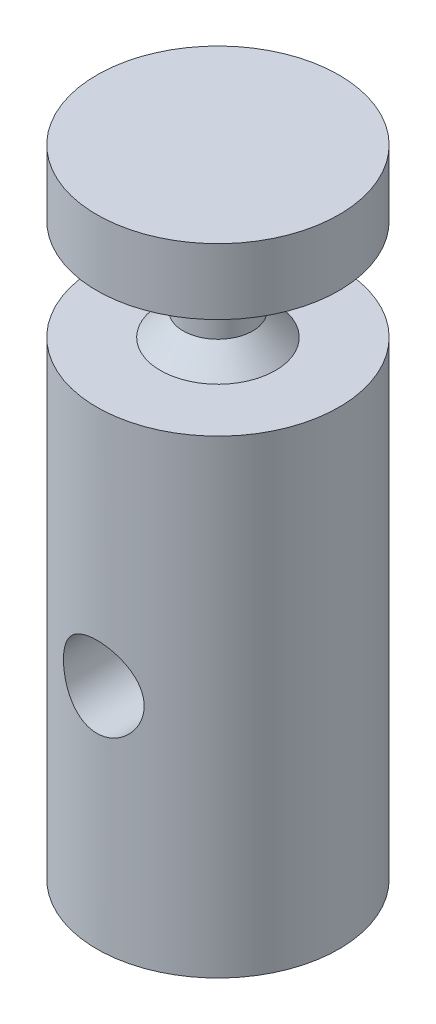
ISO-10303-21;
HEADER;
FILE_DESCRIPTION(('STEP AP214'),'2;1');
FILE_NAME('part.step','',(''),(''),'','','');
FILE_SCHEMA(('AUTOMOTIVE_DESIGN { 1 0 10303 214 1 1 1 1 }'));
ENDSEC;
DATA;
#1=APPLICATION_CONTEXT('core data for automotive mechanical design processes');
#2=APPLICATION_PROTOCOL_DEFINITION('international standard','automotive_design',2000,#1);
#3=PRODUCT_CONTEXT('',#1,'mechanical');
#4=PRODUCT('Part','Part','',(#3));
#5=PRODUCT_RELATED_PRODUCT_CATEGORY('part','',(#4));
#6=PRODUCT_DEFINITION_FORMATION('','',#4);
#7=PRODUCT_DEFINITION_CONTEXT('part definition',#1,'design');
#8=PRODUCT_DEFINITION('design','',#6,#7);
#9=PRODUCT_DEFINITION_SHAPE('','',#8);
#10=(LENGTH_UNIT() NAMED_UNIT(*) SI_UNIT(.MILLI.,.METRE.));
#11=(NAMED_UNIT(*) PLANE_ANGLE_UNIT() SI_UNIT($,.RADIAN.));
#12=(NAMED_UNIT(*) SI_UNIT($,.STERADIAN.) SOLID_ANGLE_UNIT());
#13=UNCERTAINTY_MEASURE_WITH_UNIT(LENGTH_MEASURE(1.E-05),#10,'distance_accuracy_value','');
#14=(GEOMETRIC_REPRESENTATION_CONTEXT(3) GLOBAL_UNCERTAINTY_ASSIGNED_CONTEXT((#13)) GLOBAL_UNIT_ASSIGNED_CONTEXT((#10,
#11,#12)) REPRESENTATION_CONTEXT('',''));
#15=CARTESIAN_POINT('',(0.,0.,0.));
#16=DIRECTION('',(0.,0.,1.));
#17=DIRECTION('',(1.,0.,0.));
#18=AXIS2_PLACEMENT_3D('',#15,#16,#17);
#19=CARTESIAN_POINT('',(0.,38.71775,0.));
#20=DIRECTION('',(0.,-1.,0.));
#21=DIRECTION('',(0.,0.,-1.));
#22=AXIS2_PLACEMENT_3D('',#19,#20,#21);
#23=CONICAL_SURFACE('',#22,2.73,0.785398163397443);
#24=CARTESIAN_POINT('',(0.,36.92275,0.));
#25=DIRECTION('',(0.,-1.,0.));
#26=DIRECTION('',(0.,0.,-1.));
#27=AXIS2_PLACEMENT_3D('',#24,#25,#26);
#28=CIRCLE('',#27,4.52499999999999);
#29=CARTESIAN_POINT('',(0.,36.92275,-4.52499999999999));
#30=VERTEX_POINT('',#29);
#31=EDGE_CURVE('E48',#30,#30,#28,.T.);
#32=ORIENTED_EDGE('',*,*,#31,.F.);
#33=EDGE_LOOP('',(#32));
#34=FACE_BOUND('',#33,.T.);
#35=CARTESIAN_POINT('',(0.,38.71775,0.));
#36=DIRECTION('',(0.,-1.,0.));
#37=DIRECTION('',(0.,0.,-1.));
#38=AXIS2_PLACEMENT_3D('',#35,#36,#37);
#39=CIRCLE('',#38,2.73);
#40=CARTESIAN_POINT('',(0.,38.71775,-2.73));
#41=VERTEX_POINT('',#40);
#42=EDGE_CURVE('E103',#41,#41,#39,.T.);
#43=ORIENTED_EDGE('',*,*,#42,.T.);
#44=EDGE_LOOP('',(#43));
#45=FACE_BOUND('',#44,.T.);
#46=ADVANCED_FACE('F34',(#34,#45),#23,.T.);
#47=CARTESIAN_POINT('',(0.,36.92275,0.));
#48=DIRECTION('',(0.,-1.,0.));
#49=DIRECTION('',(0.,0.,-1.));
#50=AXIS2_PLACEMENT_3D('',#47,#48,#49);
#51=PLANE('',#50);
#52=CARTESIAN_POINT('',(0.,36.92275,0.));
#53=DIRECTION('',(0.,-1.,0.));
#54=DIRECTION('',(0.,0.,-1.));
#55=AXIS2_PLACEMENT_3D('',#52,#53,#54);
#56=CIRCLE('',#55,9.525);
#57=CARTESIAN_POINT('',(0.,36.92275,-9.525));
#58=VERTEX_POINT('',#57);
#59=EDGE_CURVE('E52',#58,#58,#56,.T.);
#60=ORIENTED_EDGE('',*,*,#59,.F.);
#61=EDGE_LOOP('',(#60));
#62=FACE_BOUND('',#61,.T.);
#63=ORIENTED_EDGE('',*,*,#31,.T.);
#64=EDGE_LOOP('',(#63));
#65=FACE_BOUND('',#64,.T.);
#66=ADVANCED_FACE('F91',(#62,#65),#51,.F.);
#67=CARTESIAN_POINT('',(0.,0.,0.));
#68=DIRECTION('',(0.,-1.,0.));
#69=DIRECTION('',(0.,0.,-1.));
#70=AXIS2_PLACEMENT_3D('',#67,#68,#69);
#71=CYLINDRICAL_SURFACE('',#70,9.525);
#72=CARTESIAN_POINT('',(0.,21.05,-9.525));
#73=CARTESIAN_POINT('',(-0.173238677165346,21.0500008055979,-9.52500048580497));
#74=CARTESIAN_POINT('',(-0.346472492659896,21.0357751550461,-9.52023018186455));
#75=CARTESIAN_POINT('',(-0.687837590771685,20.9794225795053,-9.50167042395416));
#76=CARTESIAN_POINT('',(-0.855968341777244,20.9372927579622,-9.48788003366834));
#77=CARTESIAN_POINT('',(-1.18215660666814,20.8267364022556,-9.45277852602955));
#78=CARTESIAN_POINT('',(-1.34023044718816,20.7583538266918,-9.43147998545459));
#79=CARTESIAN_POINT('',(-1.6426654243569,20.5974317762382,-9.3835361515256));
#80=CARTESIAN_POINT('',(-1.78702384834388,20.5048875361167,-9.35688980370195));
#81=CARTESIAN_POINT('',(-2.06292981819569,20.2949030695734,-9.30002249856541));
#82=CARTESIAN_POINT('',(-2.19393674844713,20.1767758312229,-9.26971591772517));
#83=CARTESIAN_POINT('',(-2.43469379932911,19.9204392838066,-9.20941499436411));
#84=CARTESIAN_POINT('',(-2.54443923892903,19.782225564102,-9.17942072197493));
#85=CARTESIAN_POINT('',(-2.74264419157344,19.4847722592512,-9.12219830615344));
#86=CARTESIAN_POINT('',(-2.83040092485177,19.3250423763505,-9.0950744970031));
#87=CARTESIAN_POINT('',(-2.97757492456176,18.9920409000941,-9.04796594704058));
#88=CARTESIAN_POINT('',(-3.03700083920297,18.8187734580083,-9.02797902810367));
#89=CARTESIAN_POINT('',(-3.12379824029158,18.4697625217479,-8.99830887880273));
#90=CARTESIAN_POINT('',(-3.15218269826286,18.2942993630472,-8.98830104068516));
#91=CARTESIAN_POINT('',(-3.17925806658696,17.9408375805551,-8.97876209798686));
#92=CARTESIAN_POINT('',(-3.17795815259497,17.7628397572483,-8.97922775597168));
#93=CARTESIAN_POINT('',(-3.14648819425835,17.4180011983402,-8.99029872650972));
#94=CARTESIAN_POINT('',(-3.1176401743052,17.2510223207321,-9.00043970379417));
#95=CARTESIAN_POINT('',(-3.03404956704689,16.9244258927483,-9.02895888275449));
#96=CARTESIAN_POINT('',(-2.97930387942918,16.7648092262437,-9.04733807064542));
#97=CARTESIAN_POINT('',(-2.84460650934116,16.4544645200471,-9.09059367841715));
#98=CARTESIAN_POINT('',(-2.76426310464555,16.3039210191343,-9.11556996393148));
#99=CARTESIAN_POINT('',(-2.58092291251246,16.0180348662119,-9.16916373477931));
#100=CARTESIAN_POINT('',(-2.47791958175571,15.8826966219865,-9.19778227084722));
#101=CARTESIAN_POINT('',(-2.2458341312661,15.6236341758396,-9.25726270107577));
#102=CARTESIAN_POINT('',(-2.11567125149228,15.5008851949337,-9.28816371201626));
#103=CARTESIAN_POINT('',(-1.83622813465495,15.2787032283437,-9.34742029378841));
#104=CARTESIAN_POINT('',(-1.68694606622308,15.1792724788277,-9.37577562033364));
#105=CARTESIAN_POINT('',(-1.3714336714219,15.0057642467537,-9.42711817702495));
#106=CARTESIAN_POINT('',(-1.20504990262186,14.9319480649932,-9.45004936275524));
#107=CARTESIAN_POINT('',(-0.861279339682308,14.8136549226906,-9.4875530068358));
#108=CARTESIAN_POINT('',(-0.683896391141977,14.7691677705306,-9.50212836854241));
#109=CARTESIAN_POINT('',(-0.331418658755541,14.712523260379,-9.52079715951823));
#110=CARTESIAN_POINT('',(-0.156557979570887,14.6990481058765,-9.52531755822086));
#111=CARTESIAN_POINT('',(0.192960847123755,14.7010562386752,-9.52464766056077));
#112=CARTESIAN_POINT('',(0.367619023839891,14.7165346379361,-9.51945900331475));
#113=CARTESIAN_POINT('',(0.706500575516011,14.7749678070617,-9.50023578476806));
#114=CARTESIAN_POINT('',(0.870879661700627,14.8171137042072,-9.48646180908035));
#115=CARTESIAN_POINT('',(1.19016766849014,14.9266741861819,-9.45171613685472));
#116=CARTESIAN_POINT('',(1.34507537851482,14.9940919933102,-9.43074352248193));
#117=CARTESIAN_POINT('',(1.64556534104864,15.1542486210945,-9.38304356837145));
#118=CARTESIAN_POINT('',(1.79079512051444,15.2476068336741,-9.35617936849621));
#119=CARTESIAN_POINT('',(2.06395583568048,15.4562664262928,-9.29974181184133));
#120=CARTESIAN_POINT('',(2.19188146775095,15.5715745079009,-9.27016762910402));
#121=CARTESIAN_POINT('',(2.43285171228499,15.8270575344459,-9.20993992337912));
#122=CARTESIAN_POINT('',(2.54495607735531,15.9681242954928,-9.17929841452584));
#123=CARTESIAN_POINT('',(2.74401763337734,16.2677247277996,-9.121774152107));
#124=CARTESIAN_POINT('',(2.83097461468096,16.4262585446632,-9.09489142987857));
#125=CARTESIAN_POINT('',(2.97687025407194,16.7563618235454,-9.04819093937643));
#126=CARTESIAN_POINT('',(3.03586556962393,16.9279041013608,-9.02835890517708));
#127=CARTESIAN_POINT('',(3.12386556696094,17.2793022138901,-8.99829392572978));
#128=CARTESIAN_POINT('',(3.15288375947875,17.4591542651588,-8.98805665630055));
#129=CARTESIAN_POINT('',(3.17905219686555,17.8121257799299,-8.97883201925513));
#130=CARTESIAN_POINT('',(3.17776306695416,17.9851164304107,-8.97929370817293));
#131=CARTESIAN_POINT('',(3.14719428169959,18.3282791128775,-8.99005281690779));
#132=CARTESIAN_POINT('',(3.117916292281,18.4984513120074,-9.00034965132723));
#133=CARTESIAN_POINT('',(3.03330550668566,18.8279307300329,-9.02920864668031));
#134=CARTESIAN_POINT('',(2.97847812359925,18.9873829193893,-9.04761011221366));
#135=CARTESIAN_POINT('',(2.84473448628719,19.294947017029,-9.09054566248638));
#136=CARTESIAN_POINT('',(2.76581288515832,19.4430563990219,-9.11508110823773));
#137=CARTESIAN_POINT('',(2.58210269895238,19.7307356520052,-9.16885482792697));
#138=CARTESIAN_POINT('',(2.47633567077754,19.8696508935274,-9.19825159463785));
#139=CARTESIAN_POINT('',(2.24359115395568,20.1282651574948,-9.25777156199328));
#140=CARTESIAN_POINT('',(2.11660766813344,20.2479587278096,-9.28789496596782));
#141=CARTESIAN_POINT('',(1.83909194322317,20.4694335090181,-9.34688346918603));
#142=CARTESIAN_POINT('',(1.68783480536163,20.5703348041094,-9.3756537721899));
#143=CARTESIAN_POINT('',(1.36955960976602,20.7451696116008,-9.42740021973043));
#144=CARTESIAN_POINT('',(1.2025455950702,20.8191100183025,-9.45037784507677));
#145=CARTESIAN_POINT('',(0.865167329863093,20.9348161831515,-9.4870751034262));
#146=CARTESIAN_POINT('',(0.695286130622594,20.9778718303862,-9.50116249441509));
#147=CARTESIAN_POINT('',(0.350267320832533,21.0354593911499,-9.52012342428904));
#148=CARTESIAN_POINT('',(0.175131176180769,21.0499991856015,-9.52499950888798));
#149=CARTESIAN_POINT('',(0.,21.05,-9.525));
#150=B_SPLINE_CURVE_WITH_KNOTS('',3,(#72,#73,#74,#75,#76,#77,#78,#79,#80,#81,#82,#83,#84,#85,
#86,#87,#88,#89,#90,#91,#92,#93,#94,#95,#96,#97,#98,#99,#100,#101,#102,#103,#104,#105,#106,#107,
#108,#109,#110,#111,#112,#113,#114,#115,#116,#117,#118,#119,#120,#121,#122,#123,#124,#125,#126,
#127,#128,#129,#130,#131,#132,#133,#134,#135,#136,#137,#138,#139,#140,#141,#142,#143,#144,#145,
#146,#147,#148,#149),.UNSPECIFIED.,.T.,.F.,(4,2,2,2,2,2,2,2,2,2,2,2,2,2,2,2,2,2,2,2,2,2,2,2,2,2,
2,2,2,2,2,2,2,2,2,2,2,2,4),(0.,0.519071561632584,1.03819701322437,1.55645698636311,
2.07481924951214,2.6093637259775,3.14402575687908,3.69406121814518,4.24392866899744,
4.77526114230341,5.30642937910265,5.81332424300313,6.32027980466153,6.83539943417538,
7.35066800622306,7.89283745951088,8.43505888444011,8.98265937939883,9.53006948685133,
10.0537512658116,10.5773446429626,11.0857715158082,11.5942632377703,12.1161301950386,
12.638156741095,13.1839024764638,13.7296527614611,14.2742924389999,14.8186865394104,
15.3351123975402,15.8515075194061,16.3580948898032,16.8647947620872,17.3936046174647,
17.9225642031799,18.4721392315144,19.0215736265904,19.5464607283685,20.0712027467109),.UNSPECIFIED.);
#151=CARTESIAN_POINT('',(0.,21.05,-9.525));
#152=VERTEX_POINT('',#151);
#153=EDGE_CURVE('E10',#152,#152,#150,.T.);
#154=ORIENTED_EDGE('',*,*,#153,.T.);
#155=EDGE_LOOP('',(#154));
#156=FACE_BOUND('',#155,.T.);
#157=CARTESIAN_POINT('',(3.17499999999999,17.875,8.98025612106916));
#158=CARTESIAN_POINT('',(3.17500081898398,17.7020635448955,8.98025555134128));
#159=CARTESIAN_POINT('',(3.16082293820152,17.5291320105601,8.98530617498472));
#160=CARTESIAN_POINT('',(3.10467734311196,17.1883922133433,9.00485797707984));
#161=CARTESIAN_POINT('',(3.06270505113466,17.0205847991549,9.01936071226449));
#162=CARTESIAN_POINT('',(2.95260866704957,16.6950846147336,9.05599546711913));
#163=CARTESIAN_POINT('',(2.8845358279553,16.5373727240194,9.07811252608947));
#164=CARTESIAN_POINT('',(2.72434567030137,16.2355568458602,9.12746212382781));
#165=CARTESIAN_POINT('',(2.63222304663107,16.0914558703922,9.15469579088969));
#166=CARTESIAN_POINT('',(2.42268738995613,15.8153141195759,9.21240503868727));
#167=CARTESIAN_POINT('',(2.30449228387488,15.6838835139673,9.24296141131745));
#168=CARTESIAN_POINT('',(2.04783584340569,15.4422934061118,9.30319020743184));
#169=CARTESIAN_POINT('',(1.90937126079129,15.332137319726,9.33286248831953));
#170=CARTESIAN_POINT('',(1.6116443127889,15.1334545009785,9.38891527476712));
#171=CARTESIAN_POINT('',(1.45193356813786,15.045567093288,9.41518969452597));
#172=CARTESIAN_POINT('',(1.11896913298522,14.8981467172202,9.46053437997871));
#173=CARTESIAN_POINT('',(0.945719107056892,14.8386061071633,9.47960658694531));
#174=CARTESIAN_POINT('',(0.59699149535134,14.7516386615422,9.50782564496303));
#175=CARTESIAN_POINT('',(0.421801146658171,14.723166558134,9.5172947441875));
#176=CARTESIAN_POINT('',(0.0688907525664813,14.6958207685799,9.52638456092937));
#177=CARTESIAN_POINT('',(-0.108828629001873,14.6969394535036,9.52600781684693));
#178=CARTESIAN_POINT('',(-0.454353660740361,14.7280805082471,9.51566675789472));
#179=CARTESIAN_POINT('',(-0.622274754278507,14.7569675279065,9.50607905597498));
#180=CARTESIAN_POINT('',(-0.950732918260392,14.840947714613,9.47886621303648));
#181=CARTESIAN_POINT('',(-1.11126948744901,14.8960426577609,9.46124052729002));
#182=CARTESIAN_POINT('',(-1.42288410762326,15.0315376824467,9.41945253180987));
#183=CARTESIAN_POINT('',(-1.57381010157608,15.1122608548852,9.3952073501375));
#184=CARTESIAN_POINT('',(-1.86030973354924,15.2964545647995,9.34270397898568));
#185=CARTESIAN_POINT('',(-1.99587908667345,15.3999314275652,9.31444467439657));
#186=CARTESIAN_POINT('',(-2.2545702513004,15.6324161992345,9.25532159123422));
#187=CARTESIAN_POINT('',(-2.37680549868223,15.7623967761467,9.22439783161187));
#188=CARTESIAN_POINT('',(-2.59803029922419,16.041274704182,9.1645528941526));
#189=CARTESIAN_POINT('',(-2.69701626991889,16.1901749651865,9.13563202542329));
#190=CARTESIAN_POINT('',(-2.87016016973848,16.5054752612909,9.08273917259532));
#191=CARTESIAN_POINT('',(-2.94394402199775,16.6720945169339,9.05884361979075));
#192=CARTESIAN_POINT('',(-3.06210713863013,17.0163891766308,9.01959241367422));
#193=CARTESIAN_POINT('',(-3.10649872649828,17.1940599128298,9.00423318171519));
#194=CARTESIAN_POINT('',(-3.16281207065962,17.5468267784317,8.98460345301983));
#195=CARTESIAN_POINT('',(-3.17610837823673,17.721677423577,8.9798639401205));
#196=CARTESIAN_POINT('',(-3.17374726853835,18.0711392734373,8.9806993378791));
#197=CARTESIAN_POINT('',(-3.15809511009496,18.2457505158762,8.98627237514011));
#198=CARTESIAN_POINT('',(-3.09951644367857,18.5835233661353,9.00663737436701));
#199=CARTESIAN_POINT('',(-3.05754530088866,18.7468722407289,9.02110608274668));
#200=CARTESIAN_POINT('',(-2.94866651362947,19.0641759498094,9.05727657905498));
#201=CARTESIAN_POINT('',(-2.88175444845386,19.2181291133007,9.07897964918115));
#202=CARTESIAN_POINT('',(-2.72248103184612,19.5176828361892,9.12802586366623));
#203=CARTESIAN_POINT('',(-2.62937980078822,19.6628635903877,9.1555260648837));
#204=CARTESIAN_POINT('',(-2.42120937702024,19.9360387163183,9.21276315720815));
#205=CARTESIAN_POINT('',(-2.30613370845862,20.0640280027494,9.24250070609047));
#206=CARTESIAN_POINT('',(-2.05070616623353,20.3055513494878,9.30259247675171));
#207=CARTESIAN_POINT('',(-1.90940458398561,20.4180936883098,9.33290753359822));
#208=CARTESIAN_POINT('',(-1.60917665019581,20.617933751955,9.3893275387162));
#209=CARTESIAN_POINT('',(-1.45025092494495,20.7052323734407,9.4154326365118));
#210=CARTESIAN_POINT('',(-1.12007606322254,20.8513088329359,9.46036988448664));
#211=CARTESIAN_POINT('',(-0.9489158165448,20.9102723049451,9.47924920264386));
#212=CARTESIAN_POINT('',(-0.598355629061103,20.9983355810408,9.50781089409934));
#213=CARTESIAN_POINT('',(-0.4189586869536,21.0274461648706,9.51749658708009));
#214=CARTESIAN_POINT('',(-0.0660886913556302,21.0540070963979,9.52632915775114));
#215=CARTESIAN_POINT('',(0.107266498446059,21.0528811662353,9.52594996283969));
#216=CARTESIAN_POINT('',(0.451202885375551,21.0225130466352,9.51586223949089));
#217=CARTESIAN_POINT('',(0.621784306400504,20.993273138115,9.50615446789103));
#218=CARTESIAN_POINT('',(0.952633729196784,20.9084514052213,9.47867404980259));
#219=CARTESIAN_POINT('',(1.1130225101481,20.8532953662544,9.46103195296647));
#220=CARTESIAN_POINT('',(1.42233126423385,20.7186013387665,9.41949985236771));
#221=CARTESIAN_POINT('',(1.57124915665222,20.6390589397495,9.39560871852452));
#222=CARTESIAN_POINT('',(1.85938800178039,20.4544667990761,9.34294133528522));
#223=CARTESIAN_POINT('',(1.9980473486954,20.3485831739133,9.31401720161867));
#224=CARTESIAN_POINT('',(2.25609475841495,20.1157327830791,9.25490239414217));
#225=CARTESIAN_POINT('',(2.37547664865807,19.9887592908158,9.22471131854583));
#226=CARTESIAN_POINT('',(2.59633024304514,19.7113902960114,9.16505913446274));
#227=CARTESIAN_POINT('',(2.69691791704333,19.5602725026492,9.13567286363902));
#228=CARTESIAN_POINT('',(2.87119803998104,19.2423631945837,9.08241113800574));
#229=CARTESIAN_POINT('',(2.94489751640183,19.0755757896308,9.05853424386967));
#230=CARTESIAN_POINT('',(3.06020415454822,18.7387212087504,9.02021736105684));
#231=CARTESIAN_POINT('',(3.10311136154972,18.569143063307,9.00539959321554));
#232=CARTESIAN_POINT('',(3.16050396647391,18.2247070397682,8.9854209273797));
#233=CARTESIAN_POINT('',(3.17499917194917,18.049851004721,8.98025669710439));
#234=CARTESIAN_POINT('',(3.17499999999999,17.875,8.98025612106916));
#235=B_SPLINE_CURVE_WITH_KNOTS('',3,(#157,#158,#159,#160,#161,#162,#163,#164,#165,#166,#167,
#168,#169,#170,#171,#172,#173,#174,#175,#176,#177,#178,#179,#180,#181,#182,#183,#184,#185,#186,
#187,#188,#189,#190,#191,#192,#193,#194,#195,#196,#197,#198,#199,#200,#201,#202,#203,#204,#205,
#206,#207,#208,#209,#210,#211,#212,#213,#214,#215,#216,#217,#218,#219,#220,#221,#222,#223,#224,
#225,#226,#227,#228,#229,#230,#231,#232,#233,#234),.UNSPECIFIED.,.T.,.F.,(4,2,2,2,2,2,2,2,2,2,2,
2,2,2,2,2,2,2,2,2,2,2,2,2,2,2,2,2,2,2,2,2,2,2,2,2,2,2,4),(0.,0.518161856737954,1.03640907467314,
1.55364379231513,2.07099270263878,2.60671746332529,3.14252816921061,3.69231882006111,
4.24196117528054,4.77247962078665,5.30286129234888,5.8124409032118,6.32205505300825,
6.83836754181562,7.35482374200018,7.89559553605436,8.43645060268435,8.98501631501699,
9.53335188057252,10.0569487508209,10.5804505128322,11.0859695656586,11.5915782629155,
12.1132237331089,12.6350231697725,13.1819271594322,13.7288117205516,14.2720628703095,
14.8151177853819,15.3326491885149,15.8501386073105,16.3594083542836,16.8687702617329,
17.3969527447801,17.925304015736,18.4743376618725,19.023227709973,19.5473069861654,
20.0712053232972),.UNSPECIFIED.);
#236=CARTESIAN_POINT('',(3.17499999999999,17.875,8.98025612106916));
#237=VERTEX_POINT('',#236);
#238=EDGE_CURVE('E44',#237,#237,#235,.T.);
#239=ORIENTED_EDGE('',*,*,#238,.T.);
#240=EDGE_LOOP('',(#239));
#241=FACE_BOUND('',#240,.T.);
#242=CARTESIAN_POINT('',(0.,0.,0.));
#243=DIRECTION('',(0.,-1.,0.));
#244=DIRECTION('',(0.,0.,-1.));
#245=AXIS2_PLACEMENT_3D('',#242,#243,#244);
#246=CIRCLE('',#245,9.525);
#247=CARTESIAN_POINT('',(0.,0.,-9.525));
#248=VERTEX_POINT('',#247);
#249=EDGE_CURVE('E118',#248,#248,#246,.T.);
#250=ORIENTED_EDGE('',*,*,#249,.F.);
#251=EDGE_LOOP('',(#250));
#252=FACE_BOUND('',#251,.T.);
#253=ORIENTED_EDGE('',*,*,#59,.T.);
#254=EDGE_LOOP('',(#253));
#255=FACE_BOUND('',#254,.T.);
#256=ADVANCED_FACE('F57',(#156,#241,#252,#255),#71,.T.);
#257=CARTESIAN_POINT('',(0.,0.,0.));
#258=DIRECTION('',(0.,-1.,0.));
#259=DIRECTION('',(0.,0.,-1.));
#260=AXIS2_PLACEMENT_3D('',#257,#258,#259);
#261=PLANE('',#260);
#262=ORIENTED_EDGE('',*,*,#249,.T.);
#263=EDGE_LOOP('',(#262));
#264=FACE_BOUND('',#263,.T.);
#265=ADVANCED_FACE('F84',(#264),#261,.T.);
#266=CARTESIAN_POINT('',(0.,50.038,0.));
#267=DIRECTION('',(0.,1.,0.));
#268=DIRECTION('',(0.,0.,1.));
#269=AXIS2_PLACEMENT_3D('',#266,#267,#268);
#270=PLANE('',#269);
#271=CARTESIAN_POINT('',(0.,50.038,0.));
#272=DIRECTION('',(0.,-1.,0.));
#273=DIRECTION('',(0.,0.,-1.));
#274=AXIS2_PLACEMENT_3D('',#271,#272,#273);
#275=CIRCLE('',#274,9.525);
#276=CARTESIAN_POINT('',(0.,50.038,-9.525));
#277=VERTEX_POINT('',#276);
#278=EDGE_CURVE('E115',#277,#277,#275,.T.);
#279=ORIENTED_EDGE('',*,*,#278,.F.);
#280=EDGE_LOOP('',(#279));
#281=FACE_BOUND('',#280,.T.);
#282=ADVANCED_FACE('F81',(#281),#270,.T.);
#283=CARTESIAN_POINT('',(0.,0.,0.));
#284=DIRECTION('',(0.,-1.,0.));
#285=DIRECTION('',(0.,0.,-1.));
#286=AXIS2_PLACEMENT_3D('',#283,#284,#285);
#287=CYLINDRICAL_SURFACE('',#286,9.525);
#288=CARTESIAN_POINT('',(0.,44.86275,0.));
#289=DIRECTION('',(0.,-1.,0.));
#290=DIRECTION('',(0.,0.,-1.));
#291=AXIS2_PLACEMENT_3D('',#288,#289,#290);
#292=CIRCLE('',#291,9.525);
#293=CARTESIAN_POINT('',(0.,44.86275,-9.525));
#294=VERTEX_POINT('',#293);
#295=EDGE_CURVE('E112',#294,#294,#292,.T.);
#296=ORIENTED_EDGE('',*,*,#295,.F.);
#297=EDGE_LOOP('',(#296));
#298=FACE_BOUND('',#297,.T.);
#299=ORIENTED_EDGE('',*,*,#278,.T.);
#300=EDGE_LOOP('',(#299));
#301=FACE_BOUND('',#300,.T.);
#302=ADVANCED_FACE('F77',(#298,#301),#287,.T.);
#303=CARTESIAN_POINT('',(0.,44.86275,0.));
#304=DIRECTION('',(0.,1.,0.));
#305=DIRECTION('',(0.,0.,1.));
#306=AXIS2_PLACEMENT_3D('',#303,#304,#305);
#307=PLANE('',#306);
#308=CARTESIAN_POINT('',(0.,44.86275,0.));
#309=DIRECTION('',(0.,-1.,0.));
#310=DIRECTION('',(0.,0.,-1.));
#311=AXIS2_PLACEMENT_3D('',#308,#309,#310);
#312=CIRCLE('',#311,4.525);
#313=CARTESIAN_POINT('',(0.,44.86275,-4.525));
#314=VERTEX_POINT('',#313);
#315=EDGE_CURVE('E107',#314,#314,#312,.T.);
#316=ORIENTED_EDGE('',*,*,#315,.F.);
#317=EDGE_LOOP('',(#316));
#318=FACE_BOUND('',#317,.T.);
#319=ORIENTED_EDGE('',*,*,#295,.T.);
#320=EDGE_LOOP('',(#319));
#321=FACE_BOUND('',#320,.T.);
#322=ADVANCED_FACE('F73',(#318,#321),#307,.F.);
#323=CARTESIAN_POINT('',(0.,44.86275,0.));
#324=DIRECTION('',(0.,1.,0.));
#325=DIRECTION('',(0.,0.,1.));
#326=AXIS2_PLACEMENT_3D('',#323,#324,#325);
#327=CONICAL_SURFACE('',#326,4.525,0.78539816339745);
#328=CARTESIAN_POINT('',(0.,43.06775,0.));
#329=DIRECTION('',(0.,-1.,0.));
#330=DIRECTION('',(0.,0.,-1.));
#331=AXIS2_PLACEMENT_3D('',#328,#329,#330);
#332=CIRCLE('',#331,2.73);
#333=CARTESIAN_POINT('',(0.,43.06775,-2.73));
#334=VERTEX_POINT('',#333);
#335=EDGE_CURVE('E104',#334,#334,#332,.T.);
#336=ORIENTED_EDGE('',*,*,#335,.F.);
#337=EDGE_LOOP('',(#336));
#338=FACE_BOUND('',#337,.T.);
#339=ORIENTED_EDGE('',*,*,#315,.T.);
#340=EDGE_LOOP('',(#339));
#341=FACE_BOUND('',#340,.T.);
#342=ADVANCED_FACE('F69',(#338,#341),#327,.T.);
#343=CARTESIAN_POINT('',(0.,0.,0.));
#344=DIRECTION('',(0.,-1.,0.));
#345=DIRECTION('',(0.,0.,-1.));
#346=AXIS2_PLACEMENT_3D('',#343,#344,#345);
#347=CYLINDRICAL_SURFACE('',#346,2.73);
#348=ORIENTED_EDGE('',*,*,#42,.F.);
#349=EDGE_LOOP('',(#348));
#350=FACE_BOUND('',#349,.T.);
#351=ORIENTED_EDGE('',*,*,#335,.T.);
#352=EDGE_LOOP('',(#351));
#353=FACE_BOUND('',#352,.T.);
#354=ADVANCED_FACE('F64',(#350,#353),#347,.T.);
#355=CARTESIAN_POINT('',(0.,17.875,9.525));
#356=DIRECTION('',(0.,0.,1.));
#357=DIRECTION('',(1.,0.,0.));
#358=AXIS2_PLACEMENT_3D('',#355,#356,#357);
#359=CYLINDRICAL_SURFACE('',#358,3.17499999999999);
#360=ORIENTED_EDGE('',*,*,#238,.F.);
#361=EDGE_LOOP('',(#360));
#362=FACE_BOUND('',#361,.T.);
#363=ORIENTED_EDGE('',*,*,#153,.F.);
#364=EDGE_LOOP('',(#363));
#365=FACE_BOUND('',#364,.T.);
#366=ADVANCED_FACE('F60',(#362,#365),#359,.F.);
#367=CLOSED_SHELL('',(#46,#66,#256,#265,#282,#302,#322,#342,#354,#366));
#368=MANIFOLD_SOLID_BREP('B2',#367);
#369=ADVANCED_BREP_SHAPE_REPRESENTATION('',(#18,#368),#14);
#370=SHAPE_DEFINITION_REPRESENTATION(#9,#369);
ENDSEC;
END-ISO-10303-21;
